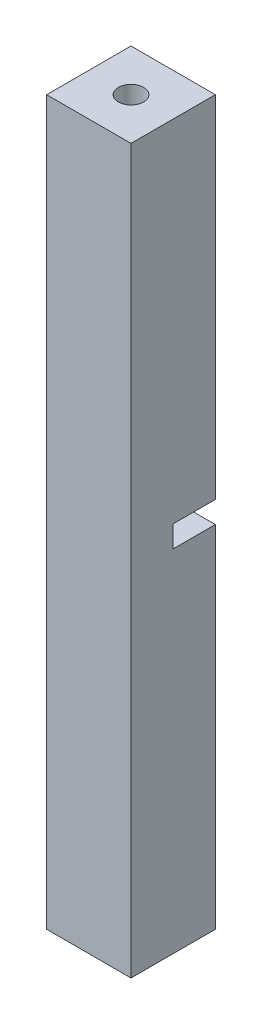
ISO-10303-21;
HEADER;
FILE_DESCRIPTION(('STEP AP214'),'2;1');
FILE_NAME('part.step','',(''),(''),'','','');
FILE_SCHEMA(('AUTOMOTIVE_DESIGN { 1 0 10303 214 1 1 1 1 }'));
ENDSEC;
DATA;
#1=APPLICATION_CONTEXT('core data for automotive mechanical design processes');
#2=APPLICATION_PROTOCOL_DEFINITION('international standard','automotive_design',2000,#1);
#3=PRODUCT_CONTEXT('',#1,'mechanical');
#4=PRODUCT('Part','Part','',(#3));
#5=PRODUCT_RELATED_PRODUCT_CATEGORY('part','',(#4));
#6=PRODUCT_DEFINITION_FORMATION('','',#4);
#7=PRODUCT_DEFINITION_CONTEXT('part definition',#1,'design');
#8=PRODUCT_DEFINITION('design','',#6,#7);
#9=PRODUCT_DEFINITION_SHAPE('','',#8);
#10=(LENGTH_UNIT() NAMED_UNIT(*) SI_UNIT(.MILLI.,.METRE.));
#11=(NAMED_UNIT(*) PLANE_ANGLE_UNIT() SI_UNIT($,.RADIAN.));
#12=(NAMED_UNIT(*) SI_UNIT($,.STERADIAN.) SOLID_ANGLE_UNIT());
#13=UNCERTAINTY_MEASURE_WITH_UNIT(LENGTH_MEASURE(1.E-05),#10,'distance_accuracy_value','');
#14=(GEOMETRIC_REPRESENTATION_CONTEXT(3) GLOBAL_UNCERTAINTY_ASSIGNED_CONTEXT((#13)) GLOBAL_UNIT_ASSIGNED_CONTEXT((#10,
#11,#12)) REPRESENTATION_CONTEXT('',''));
#15=CARTESIAN_POINT('',(0.,0.,0.));
#16=DIRECTION('',(0.,0.,1.));
#17=DIRECTION('',(1.,0.,0.));
#18=AXIS2_PLACEMENT_3D('',#15,#16,#17);
#19=CARTESIAN_POINT('',(3.5,69.8994949366117,3.5));
#20=DIRECTION('',(1.,0.,0.));
#21=DIRECTION('',(0.,0.,-1.));
#22=AXIS2_PLACEMENT_3D('',#19,#20,#21);
#23=PLANE('',#22);
#24=DIRECTION('',(0.,1.,0.));
#25=VECTOR('',#24,1.);
#26=CARTESIAN_POINT('',(3.5,69.8994949366117,0.));
#27=LINE('',#26,#25);
#28=CARTESIAN_POINT('',(3.5,29.1,0.));
#29=VERTEX_POINT('',#28);
#30=CARTESIAN_POINT('',(3.5,30.9,0.));
#31=VERTEX_POINT('',#30);
#32=EDGE_CURVE('E132',#29,#31,#27,.T.);
#33=ORIENTED_EDGE('',*,*,#32,.T.);
#34=DIRECTION('',(0.,0.,-1.));
#35=VECTOR('',#34,1.);
#36=CARTESIAN_POINT('',(3.5,30.9,3.5));
#37=LINE('',#36,#35);
#38=CARTESIAN_POINT('',(3.5,30.9,-3.5));
#39=VERTEX_POINT('',#38);
#40=EDGE_CURVE('E147',#31,#39,#37,.T.);
#41=ORIENTED_EDGE('',*,*,#40,.T.);
#42=DIRECTION('',(0.,-1.,0.));
#43=VECTOR('',#42,1.);
#44=CARTESIAN_POINT('',(3.5,69.8994949366117,-3.5));
#45=LINE('',#44,#43);
#46=CARTESIAN_POINT('',(3.5,60.,-3.5));
#47=VERTEX_POINT('',#46);
#48=EDGE_CURVE('E182',#47,#39,#45,.T.);
#49=ORIENTED_EDGE('',*,*,#48,.F.);
#50=DIRECTION('',(0.,0.,1.));
#51=VECTOR('',#50,1.);
#52=CARTESIAN_POINT('',(3.5,60.,3.5));
#53=LINE('',#52,#51);
#54=CARTESIAN_POINT('',(3.5,60.,3.5));
#55=VERTEX_POINT('',#54);
#56=EDGE_CURVE('E171',#47,#55,#53,.T.);
#57=ORIENTED_EDGE('',*,*,#56,.T.);
#58=DIRECTION('',(0.,-1.,0.));
#59=VECTOR('',#58,1.);
#60=CARTESIAN_POINT('',(3.5,69.8994949366117,3.5));
#61=LINE('',#60,#59);
#62=CARTESIAN_POINT('',(3.5,0.,3.5));
#63=VERTEX_POINT('',#62);
#64=EDGE_CURVE('E174',#55,#63,#61,.T.);
#65=ORIENTED_EDGE('',*,*,#64,.T.);
#66=DIRECTION('',(0.,0.,1.));
#67=VECTOR('',#66,1.);
#68=CARTESIAN_POINT('',(3.5,0.,3.5));
#69=LINE('',#68,#67);
#70=CARTESIAN_POINT('',(3.5,0.,-3.5));
#71=VERTEX_POINT('',#70);
#72=EDGE_CURVE('E164',#71,#63,#69,.T.);
#73=ORIENTED_EDGE('',*,*,#72,.F.);
#74=CARTESIAN_POINT('',(3.5,29.1,-3.5));
#75=VERTEX_POINT('',#74);
#76=EDGE_CURVE('E178',#75,#71,#45,.T.);
#77=ORIENTED_EDGE('',*,*,#76,.F.);
#78=DIRECTION('',(0.,0.,-1.));
#79=VECTOR('',#78,1.);
#80=CARTESIAN_POINT('',(3.5,29.1,3.5));
#81=LINE('',#80,#79);
#82=EDGE_CURVE('E50',#29,#75,#81,.T.);
#83=ORIENTED_EDGE('',*,*,#82,.F.);
#84=EDGE_LOOP('',(#33,#41,#49,#57,#65,#73,#77,#83));
#85=FACE_BOUND('',#84,.T.);
#86=ADVANCED_FACE('F33',(#85),#23,.T.);
#87=CARTESIAN_POINT('',(-3.5,69.8994949366117,3.5));
#88=DIRECTION('',(-1.,0.,0.));
#89=DIRECTION('',(0.,0.,1.));
#90=AXIS2_PLACEMENT_3D('',#87,#88,#89);
#91=PLANE('',#90);
#92=DIRECTION('',(0.,-1.,0.));
#93=VECTOR('',#92,1.);
#94=CARTESIAN_POINT('',(-3.5,69.8994949366117,-3.5));
#95=LINE('',#94,#93);
#96=CARTESIAN_POINT('',(-3.5,60.,-3.5));
#97=VERTEX_POINT('',#96);
#98=CARTESIAN_POINT('',(-3.5,30.9,-3.5));
#99=VERTEX_POINT('',#98);
#100=EDGE_CURVE('E170',#97,#99,#95,.T.);
#101=ORIENTED_EDGE('',*,*,#100,.T.);
#102=DIRECTION('',(0.,0.,1.));
#103=VECTOR('',#102,1.);
#104=CARTESIAN_POINT('',(-3.5,30.9,3.5));
#105=LINE('',#104,#103);
#106=CARTESIAN_POINT('',(-3.5,30.9,0.));
#107=VERTEX_POINT('',#106);
#108=EDGE_CURVE('E131',#99,#107,#105,.T.);
#109=ORIENTED_EDGE('',*,*,#108,.T.);
#110=DIRECTION('',(0.,-1.,0.));
#111=VECTOR('',#110,1.);
#112=CARTESIAN_POINT('',(-3.5,69.8994949366117,0.));
#113=LINE('',#112,#111);
#114=CARTESIAN_POINT('',(-3.5,29.1,0.));
#115=VERTEX_POINT('',#114);
#116=EDGE_CURVE('E120',#107,#115,#113,.T.);
#117=ORIENTED_EDGE('',*,*,#116,.T.);
#118=DIRECTION('',(0.,0.,1.));
#119=VECTOR('',#118,1.);
#120=CARTESIAN_POINT('',(-3.5,29.1,3.5));
#121=LINE('',#120,#119);
#122=CARTESIAN_POINT('',(-3.5,29.1,-3.5));
#123=VERTEX_POINT('',#122);
#124=EDGE_CURVE('E111',#123,#115,#121,.T.);
#125=ORIENTED_EDGE('',*,*,#124,.F.);
#126=CARTESIAN_POINT('',(-3.5,0.,-3.5));
#127=VERTEX_POINT('',#126);
#128=EDGE_CURVE('E181',#123,#127,#95,.T.);
#129=ORIENTED_EDGE('',*,*,#128,.T.);
#130=DIRECTION('',(0.,0.,-1.));
#131=VECTOR('',#130,1.);
#132=CARTESIAN_POINT('',(-3.5,0.,3.5));
#133=LINE('',#132,#131);
#134=CARTESIAN_POINT('',(-3.5,0.,3.5));
#135=VERTEX_POINT('',#134);
#136=EDGE_CURVE('E159',#135,#127,#133,.T.);
#137=ORIENTED_EDGE('',*,*,#136,.F.);
#138=DIRECTION('',(0.,-1.,0.));
#139=VECTOR('',#138,1.);
#140=CARTESIAN_POINT('',(-3.5,69.8994949366117,3.5));
#141=LINE('',#140,#139);
#142=CARTESIAN_POINT('',(-3.5,60.,3.5));
#143=VERTEX_POINT('',#142);
#144=EDGE_CURVE('E166',#143,#135,#141,.T.);
#145=ORIENTED_EDGE('',*,*,#144,.F.);
#146=DIRECTION('',(0.,0.,-1.));
#147=VECTOR('',#146,1.);
#148=CARTESIAN_POINT('',(-3.5,60.,3.5));
#149=LINE('',#148,#147);
#150=EDGE_CURVE('E179',#143,#97,#149,.T.);
#151=ORIENTED_EDGE('',*,*,#150,.T.);
#152=EDGE_LOOP('',(#101,#109,#117,#125,#129,#137,#145,#151));
#153=FACE_BOUND('',#152,.T.);
#154=ADVANCED_FACE('F130',(#153),#91,.T.);
#155=CARTESIAN_POINT('',(-3.5,69.8994949366117,-3.5));
#156=DIRECTION('',(0.,0.,-1.));
#157=DIRECTION('',(-1.,0.,0.));
#158=AXIS2_PLACEMENT_3D('',#155,#156,#157);
#159=PLANE('',#158);
#160=ORIENTED_EDGE('',*,*,#48,.T.);
#161=DIRECTION('',(-1.,0.,0.));
#162=VECTOR('',#161,1.);
#163=CARTESIAN_POINT('',(-3.5,30.9,-3.5));
#164=LINE('',#163,#162);
#165=EDGE_CURVE('E143',#39,#99,#164,.T.);
#166=ORIENTED_EDGE('',*,*,#165,.T.);
#167=ORIENTED_EDGE('',*,*,#100,.F.);
#168=DIRECTION('',(1.,0.,0.));
#169=VECTOR('',#168,1.);
#170=CARTESIAN_POINT('',(-3.5,60.,-3.5));
#171=LINE('',#170,#169);
#172=EDGE_CURVE('E175',#97,#47,#171,.T.);
#173=ORIENTED_EDGE('',*,*,#172,.T.);
#174=EDGE_LOOP('',(#160,#166,#167,#173));
#175=FACE_BOUND('',#174,.T.);
#176=ADVANCED_FACE('F221',(#175),#159,.T.);
#177=CARTESIAN_POINT('',(0.,30.9,0.));
#178=DIRECTION('',(0.,-1.,0.));
#179=DIRECTION('',(0.,0.,-1.));
#180=AXIS2_PLACEMENT_3D('',#177,#178,#179);
#181=CYLINDRICAL_SURFACE('',#180,3.05);
#182=CARTESIAN_POINT('',(0.,30.9,0.));
#183=DIRECTION('',(0.,1.,0.));
#184=DIRECTION('',(0.,0.,1.));
#185=AXIS2_PLACEMENT_3D('',#182,#183,#184);
#186=CIRCLE('',#185,3.05);
#187=CARTESIAN_POINT('',(-3.05,30.9,0.));
#188=VERTEX_POINT('',#187);
#189=CARTESIAN_POINT('',(3.05,30.9,0.));
#190=VERTEX_POINT('',#189);
#191=EDGE_CURVE('E152',#188,#190,#186,.T.);
#192=ORIENTED_EDGE('',*,*,#191,.T.);
#193=DIRECTION('',(0.,-1.,0.));
#194=VECTOR('',#193,1.);
#195=CARTESIAN_POINT('',(3.05,30.9,0.));
#196=LINE('',#195,#194);
#197=CARTESIAN_POINT('',(3.05,29.1,0.));
#198=VERTEX_POINT('',#197);
#199=EDGE_CURVE('E133',#190,#198,#196,.T.);
#200=ORIENTED_EDGE('',*,*,#199,.T.);
#201=CARTESIAN_POINT('',(0.,29.1,0.));
#202=DIRECTION('',(0.,1.,0.));
#203=DIRECTION('',(0.,0.,1.));
#204=AXIS2_PLACEMENT_3D('',#201,#202,#203);
#205=CIRCLE('',#204,3.05);
#206=CARTESIAN_POINT('',(-3.05,29.1,0.));
#207=VERTEX_POINT('',#206);
#208=EDGE_CURVE('E150',#207,#198,#205,.T.);
#209=ORIENTED_EDGE('',*,*,#208,.F.);
#210=DIRECTION('',(0.,-1.,0.));
#211=VECTOR('',#210,1.);
#212=CARTESIAN_POINT('',(-3.05,30.9,0.));
#213=LINE('',#212,#211);
#214=EDGE_CURVE('E123',#207,#188,#213,.F.);
#215=ORIENTED_EDGE('',*,*,#214,.T.);
#216=EDGE_LOOP('',(#192,#200,#209,#215));
#217=FACE_BOUND('',#216,.T.);
#218=ADVANCED_FACE('F231',(#217),#181,.F.);
#219=CARTESIAN_POINT('',(0.,60.,0.));
#220=DIRECTION('',(0.,-1.,0.));
#221=DIRECTION('',(0.,0.,-1.));
#222=AXIS2_PLACEMENT_3D('',#219,#220,#221);
#223=CYLINDRICAL_SURFACE('',#222,1.05);
#224=CARTESIAN_POINT('',(0.,0.,0.));
#225=DIRECTION('',(0.,1.,0.));
#226=DIRECTION('',(0.,0.,1.));
#227=AXIS2_PLACEMENT_3D('',#224,#225,#226);
#228=CIRCLE('',#227,1.05);
#229=CARTESIAN_POINT('',(0.,0.,1.05));
#230=VERTEX_POINT('',#229);
#231=EDGE_CURVE('E42',#230,#230,#228,.T.);
#232=ORIENTED_EDGE('',*,*,#231,.F.);
#233=EDGE_LOOP('',(#232));
#234=FACE_BOUND('',#233,.T.);
#235=CARTESIAN_POINT('',(0.,29.1,0.));
#236=DIRECTION('',(0.,1.,0.));
#237=DIRECTION('',(0.,0.,1.));
#238=AXIS2_PLACEMENT_3D('',#235,#236,#237);
#239=CIRCLE('',#238,1.05);
#240=CARTESIAN_POINT('',(0.,29.1,1.05));
#241=VERTEX_POINT('',#240);
#242=EDGE_CURVE('E155',#241,#241,#239,.T.);
#243=ORIENTED_EDGE('',*,*,#242,.T.);
#244=EDGE_LOOP('',(#243));
#245=FACE_BOUND('',#244,.T.);
#246=ADVANCED_FACE('F206',(#234,#245),#223,.F.);
#247=CARTESIAN_POINT('',(-3.5,69.8994949366117,3.5));
#248=DIRECTION('',(0.,0.,1.));
#249=DIRECTION('',(1.,0.,0.));
#250=AXIS2_PLACEMENT_3D('',#247,#248,#249);
#251=PLANE('',#250);
#252=ORIENTED_EDGE('',*,*,#144,.T.);
#253=DIRECTION('',(-1.,0.,0.));
#254=VECTOR('',#253,1.);
#255=CARTESIAN_POINT('',(-3.5,0.,3.5));
#256=LINE('',#255,#254);
#257=EDGE_CURVE('E162',#63,#135,#256,.T.);
#258=ORIENTED_EDGE('',*,*,#257,.F.);
#259=ORIENTED_EDGE('',*,*,#64,.F.);
#260=DIRECTION('',(-1.,0.,0.));
#261=VECTOR('',#260,1.);
#262=CARTESIAN_POINT('',(-3.5,60.,3.5));
#263=LINE('',#262,#261);
#264=EDGE_CURVE('E167',#55,#143,#263,.T.);
#265=ORIENTED_EDGE('',*,*,#264,.T.);
#266=EDGE_LOOP('',(#252,#258,#259,#265));
#267=FACE_BOUND('',#266,.T.);
#268=ADVANCED_FACE('F225',(#267),#251,.T.);
#269=DIRECTION('',(-1.,0.,0.));
#270=VECTOR('',#269,1.);
#271=CARTESIAN_POINT('',(-3.5,29.1,-3.5));
#272=LINE('',#271,#270);
#273=EDGE_CURVE('E113',#75,#123,#272,.T.);
#274=ORIENTED_EDGE('',*,*,#273,.F.);
#275=ORIENTED_EDGE('',*,*,#76,.T.);
#276=DIRECTION('',(1.,0.,0.));
#277=VECTOR('',#276,1.);
#278=CARTESIAN_POINT('',(-3.5,0.,-3.5));
#279=LINE('',#278,#277);
#280=EDGE_CURVE('E156',#127,#71,#279,.T.);
#281=ORIENTED_EDGE('',*,*,#280,.F.);
#282=ORIENTED_EDGE('',*,*,#128,.F.);
#283=EDGE_LOOP('',(#274,#275,#281,#282));
#284=FACE_BOUND('',#283,.T.);
#285=ADVANCED_FACE('F204',(#284),#159,.T.);
#286=CARTESIAN_POINT('',(0.,30.9,0.));
#287=DIRECTION('',(0.,1.,0.));
#288=DIRECTION('',(0.,0.,1.));
#289=AXIS2_PLACEMENT_3D('',#286,#287,#288);
#290=CIRCLE('',#289,1.05);
#291=CARTESIAN_POINT('',(0.,30.9,1.05));
#292=VERTEX_POINT('',#291);
#293=EDGE_CURVE('E37',#292,#292,#290,.T.);
#294=ORIENTED_EDGE('',*,*,#293,.F.);
#295=EDGE_LOOP('',(#294));
#296=FACE_BOUND('',#295,.T.);
#297=CARTESIAN_POINT('',(0.,60.,0.));
#298=DIRECTION('',(0.,1.,0.));
#299=DIRECTION('',(0.,0.,1.));
#300=AXIS2_PLACEMENT_3D('',#297,#298,#299);
#301=CIRCLE('',#300,1.05);
#302=CARTESIAN_POINT('',(0.,60.,1.05));
#303=VERTEX_POINT('',#302);
#304=EDGE_CURVE('E11',#303,#303,#301,.T.);
#305=ORIENTED_EDGE('',*,*,#304,.T.);
#306=EDGE_LOOP('',(#305));
#307=FACE_BOUND('',#306,.T.);
#308=ADVANCED_FACE('F200',(#296,#307),#223,.F.);
#309=CARTESIAN_POINT('',(0.,60.,0.));
#310=DIRECTION('',(0.,1.,0.));
#311=DIRECTION('',(0.,0.,1.));
#312=AXIS2_PLACEMENT_3D('',#309,#310,#311);
#313=PLANE('',#312);
#314=ORIENTED_EDGE('',*,*,#264,.F.);
#315=ORIENTED_EDGE('',*,*,#56,.F.);
#316=ORIENTED_EDGE('',*,*,#172,.F.);
#317=ORIENTED_EDGE('',*,*,#150,.F.);
#318=EDGE_LOOP('',(#314,#315,#316,#317));
#319=FACE_BOUND('',#318,.T.);
#320=ORIENTED_EDGE('',*,*,#304,.F.);
#321=EDGE_LOOP('',(#320));
#322=FACE_BOUND('',#321,.T.);
#323=ADVANCED_FACE('F203',(#319,#322),#313,.T.);
#324=CARTESIAN_POINT('',(0.,0.,0.));
#325=DIRECTION('',(0.,1.,0.));
#326=DIRECTION('',(0.,0.,1.));
#327=AXIS2_PLACEMENT_3D('',#324,#325,#326);
#328=PLANE('',#327);
#329=ORIENTED_EDGE('',*,*,#136,.T.);
#330=ORIENTED_EDGE('',*,*,#280,.T.);
#331=ORIENTED_EDGE('',*,*,#72,.T.);
#332=ORIENTED_EDGE('',*,*,#257,.T.);
#333=EDGE_LOOP('',(#329,#330,#331,#332));
#334=FACE_BOUND('',#333,.T.);
#335=ORIENTED_EDGE('',*,*,#231,.T.);
#336=EDGE_LOOP('',(#335));
#337=FACE_BOUND('',#336,.T.);
#338=ADVANCED_FACE('F35',(#334,#337),#328,.F.);
#339=CARTESIAN_POINT('',(0.,30.9,0.));
#340=DIRECTION('',(0.,1.,0.));
#341=DIRECTION('',(0.,0.,1.));
#342=AXIS2_PLACEMENT_3D('',#339,#340,#341);
#343=PLANE('',#342);
#344=ORIENTED_EDGE('',*,*,#293,.T.);
#345=EDGE_LOOP('',(#344));
#346=FACE_BOUND('',#345,.T.);
#347=ORIENTED_EDGE('',*,*,#191,.F.);
#348=DIRECTION('',(1.,0.,0.));
#349=VECTOR('',#348,1.);
#350=CARTESIAN_POINT('',(-4.26665317416418,30.9,0.));
#351=LINE('',#350,#349);
#352=EDGE_CURVE('E251',#107,#188,#351,.T.);
#353=ORIENTED_EDGE('',*,*,#352,.F.);
#354=ORIENTED_EDGE('',*,*,#108,.F.);
#355=ORIENTED_EDGE('',*,*,#165,.F.);
#356=ORIENTED_EDGE('',*,*,#40,.F.);
#357=EDGE_CURVE('E125',#190,#31,#351,.T.);
#358=ORIENTED_EDGE('',*,*,#357,.F.);
#359=EDGE_LOOP('',(#347,#353,#354,#355,#356,#358));
#360=FACE_BOUND('',#359,.T.);
#361=ADVANCED_FACE('F197',(#346,#360),#343,.F.);
#362=CARTESIAN_POINT('',(0.,29.1,0.));
#363=DIRECTION('',(0.,1.,0.));
#364=DIRECTION('',(0.,0.,1.));
#365=AXIS2_PLACEMENT_3D('',#362,#363,#364);
#366=PLANE('',#365);
#367=ORIENTED_EDGE('',*,*,#242,.F.);
#368=EDGE_LOOP('',(#367));
#369=FACE_BOUND('',#368,.T.);
#370=ORIENTED_EDGE('',*,*,#208,.T.);
#371=DIRECTION('',(1.,0.,0.));
#372=VECTOR('',#371,1.);
#373=CARTESIAN_POINT('',(-4.26665317416418,29.1,0.));
#374=LINE('',#373,#372);
#375=EDGE_CURVE('E126',#198,#29,#374,.T.);
#376=ORIENTED_EDGE('',*,*,#375,.T.);
#377=ORIENTED_EDGE('',*,*,#82,.T.);
#378=ORIENTED_EDGE('',*,*,#273,.T.);
#379=ORIENTED_EDGE('',*,*,#124,.T.);
#380=EDGE_CURVE('E57',#115,#207,#374,.T.);
#381=ORIENTED_EDGE('',*,*,#380,.T.);
#382=EDGE_LOOP('',(#370,#376,#377,#378,#379,#381));
#383=FACE_BOUND('',#382,.T.);
#384=ADVANCED_FACE('F112',(#369,#383),#366,.T.);
#385=CARTESIAN_POINT('',(-4.26665317416418,30.9,0.));
#386=DIRECTION('',(0.,0.,-1.));
#387=DIRECTION('',(-1.,0.,0.));
#388=AXIS2_PLACEMENT_3D('',#385,#386,#387);
#389=PLANE('',#388);
#390=ORIENTED_EDGE('',*,*,#375,.F.);
#391=ORIENTED_EDGE('',*,*,#199,.F.);
#392=ORIENTED_EDGE('',*,*,#357,.T.);
#393=ORIENTED_EDGE('',*,*,#32,.F.);
#394=EDGE_LOOP('',(#390,#391,#392,#393));
#395=FACE_BOUND('',#394,.T.);
#396=ADVANCED_FACE('F239',(#395),#389,.T.);
#397=ORIENTED_EDGE('',*,*,#352,.T.);
#398=ORIENTED_EDGE('',*,*,#214,.F.);
#399=ORIENTED_EDGE('',*,*,#380,.F.);
#400=ORIENTED_EDGE('',*,*,#116,.F.);
#401=EDGE_LOOP('',(#397,#398,#399,#400));
#402=FACE_BOUND('',#401,.T.);
#403=ADVANCED_FACE('F119',(#402),#389,.T.);
#404=CLOSED_SHELL('',(#86,#154,#176,#218,#246,#268,#285,#308,#323,#338,#361,#384,#396,#403));
#405=MANIFOLD_SOLID_BREP('B2',#404);
#406=ADVANCED_BREP_SHAPE_REPRESENTATION('',(#18,#405),#14);
#407=SHAPE_DEFINITION_REPRESENTATION(#9,#406);
ENDSEC;
END-ISO-10303-21;
